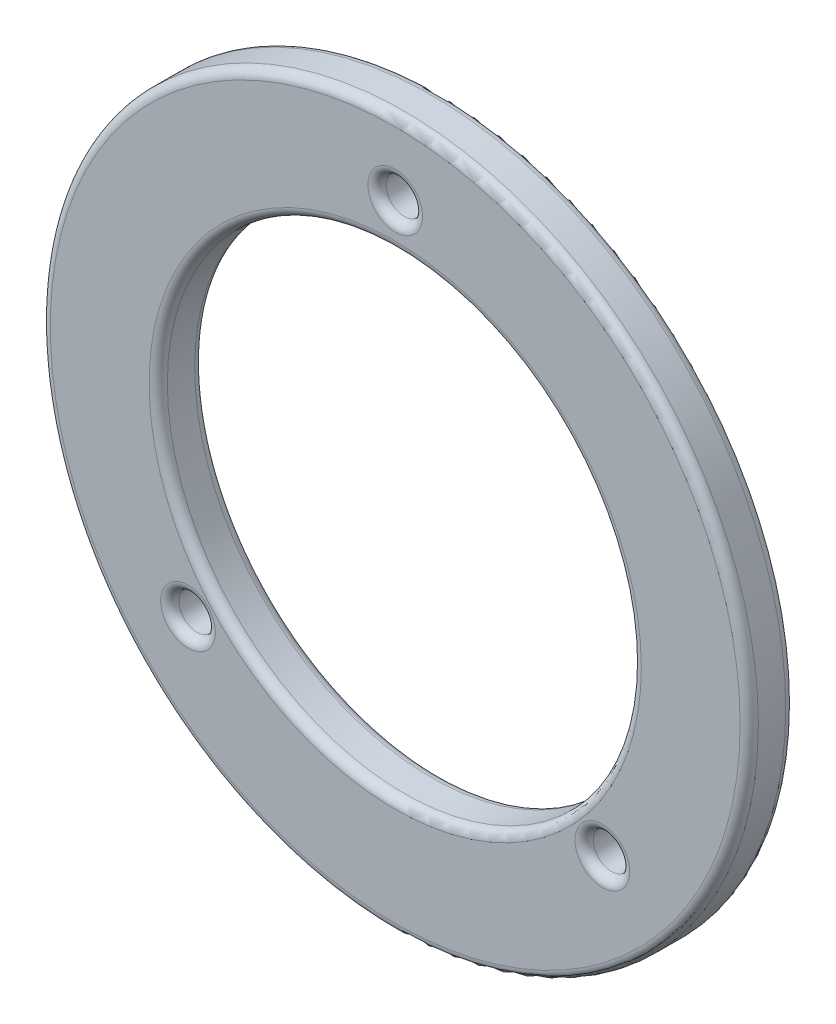
ISO-10303-21;
HEADER;
FILE_DESCRIPTION(('STEP AP214'),'2;1');
FILE_NAME('part.step','',(''),(''),'','','');
FILE_SCHEMA(('AUTOMOTIVE_DESIGN { 1 0 10303 214 1 1 1 1 }'));
ENDSEC;
DATA;
#1=APPLICATION_CONTEXT('core data for automotive mechanical design processes');
#2=APPLICATION_PROTOCOL_DEFINITION('international standard','automotive_design',2000,#1);
#3=PRODUCT_CONTEXT('',#1,'mechanical');
#4=PRODUCT('Part','Part','',(#3));
#5=PRODUCT_RELATED_PRODUCT_CATEGORY('part','',(#4));
#6=PRODUCT_DEFINITION_FORMATION('','',#4);
#7=PRODUCT_DEFINITION_CONTEXT('part definition',#1,'design');
#8=PRODUCT_DEFINITION('design','',#6,#7);
#9=PRODUCT_DEFINITION_SHAPE('','',#8);
#10=(LENGTH_UNIT() NAMED_UNIT(*) SI_UNIT(.MILLI.,.METRE.));
#11=(NAMED_UNIT(*) PLANE_ANGLE_UNIT() SI_UNIT($,.RADIAN.));
#12=(NAMED_UNIT(*) SI_UNIT($,.STERADIAN.) SOLID_ANGLE_UNIT());
#13=UNCERTAINTY_MEASURE_WITH_UNIT(LENGTH_MEASURE(1.E-05),#10,'distance_accuracy_value','');
#14=(GEOMETRIC_REPRESENTATION_CONTEXT(3) GLOBAL_UNCERTAINTY_ASSIGNED_CONTEXT((#13)) GLOBAL_UNIT_ASSIGNED_CONTEXT((#10,
#11,#12)) REPRESENTATION_CONTEXT('',''));
#15=CARTESIAN_POINT('',(0.,0.,0.));
#16=DIRECTION('',(0.,0.,1.));
#17=DIRECTION('',(1.,0.,0.));
#18=AXIS2_PLACEMENT_3D('',#15,#16,#17);
#19=CARTESIAN_POINT('',(7.49400541621981E-13,39.1668000000001,3.17500000000004));
#20=DIRECTION('',(0.,0.,-1.));
#21=DIRECTION('',(-1.00000000000001,0.,0.));
#22=AXIS2_PLACEMENT_3D('',#19,#20,#21);
#23=CYLINDRICAL_SURFACE('',#22,2.54);
#24=CARTESIAN_POINT('',(-7.49400541621981E-13,39.1668000000001,-1.90500000000005));
#25=DIRECTION('',(0.,0.,1.));
#26=DIRECTION('',(1.00000000000001,0.,0.));
#27=AXIS2_PLACEMENT_3D('',#24,#25,#26);
#28=CIRCLE('',#27,2.54);
#29=CARTESIAN_POINT('',(2.53999999999928,39.1668000000001,-1.90500000000004));
#30=VERTEX_POINT('',#29);
#31=EDGE_CURVE('E96',#30,#30,#28,.F.);
#32=ORIENTED_EDGE('',*,*,#31,.T.);
#33=EDGE_LOOP('',(#32));
#34=FACE_BOUND('',#33,.T.);
#35=CARTESIAN_POINT('',(4.9960036108132E-13,39.1668000000001,1.90500000000005));
#36=DIRECTION('',(0.,0.,1.));
#37=DIRECTION('',(1.00000000000001,0.,0.));
#38=AXIS2_PLACEMENT_3D('',#35,#36,#37);
#39=CIRCLE('',#38,2.54);
#40=CARTESIAN_POINT('',(2.54000000000053,39.1668000000001,1.90500000000005));
#41=VERTEX_POINT('',#40);
#42=EDGE_CURVE('E100',#41,#41,#39,.T.);
#43=ORIENTED_EDGE('',*,*,#42,.T.);
#44=EDGE_LOOP('',(#43));
#45=FACE_BOUND('',#44,.T.);
#46=ADVANCED_FACE('F42',(#34,#45),#23,.F.);
#47=CARTESIAN_POINT('',(7.49400541621981E-13,0.,3.17500000000004));
#48=DIRECTION('',(0.,0.,-1.));
#49=DIRECTION('',(-1.00000000000001,0.,0.));
#50=AXIS2_PLACEMENT_3D('',#47,#48,#49);
#51=CYLINDRICAL_SURFACE('',#50,33.02);
#52=CARTESIAN_POINT('',(-7.49400541621981E-13,0.,-1.90500000000005));
#53=DIRECTION('',(0.,0.,1.));
#54=DIRECTION('',(1.00000000000001,0.,0.));
#55=AXIS2_PLACEMENT_3D('',#52,#53,#54);
#56=CIRCLE('',#55,33.02);
#57=CARTESIAN_POINT('',(33.0199999999996,0.,-1.90500000000003));
#58=VERTEX_POINT('',#57);
#59=EDGE_CURVE('E88',#58,#58,#56,.F.);
#60=ORIENTED_EDGE('',*,*,#59,.T.);
#61=EDGE_LOOP('',(#60));
#62=FACE_BOUND('',#61,.T.);
#63=CARTESIAN_POINT('',(7.49400541621981E-13,0.,1.90500000000005));
#64=DIRECTION('',(0.,0.,1.));
#65=DIRECTION('',(1.00000000000001,0.,0.));
#66=AXIS2_PLACEMENT_3D('',#63,#64,#65);
#67=CIRCLE('',#66,33.02);
#68=CARTESIAN_POINT('',(33.0200000000011,0.,1.90500000000006));
#69=VERTEX_POINT('',#68);
#70=EDGE_CURVE('E92',#69,#69,#67,.T.);
#71=ORIENTED_EDGE('',*,*,#70,.T.);
#72=EDGE_LOOP('',(#71));
#73=FACE_BOUND('',#72,.T.);
#74=ADVANCED_FACE('F153',(#62,#73),#51,.F.);
#75=CARTESIAN_POINT('',(28.8671000000005,-25.4558618300422,3.17500000000104));
#76=DIRECTION('',(0.,0.,-1.));
#77=DIRECTION('',(-1.00000000000001,0.,0.));
#78=AXIS2_PLACEMENT_3D('',#75,#76,#77);
#79=CYLINDRICAL_SURFACE('',#78,2.54000000000001);
#80=CARTESIAN_POINT('',(28.8671000000001,-25.4558618300422,-1.90499999999894));
#81=DIRECTION('',(0.,0.,1.));
#82=DIRECTION('',(1.00000000000001,0.,0.));
#83=AXIS2_PLACEMENT_3D('',#80,#81,#82);
#84=CIRCLE('',#83,2.54000000000001);
#85=CARTESIAN_POINT('',(31.4071000000001,-25.4558618300422,-1.90499999999893));
#86=VERTEX_POINT('',#85);
#87=EDGE_CURVE('E80',#86,#86,#84,.F.);
#88=ORIENTED_EDGE('',*,*,#87,.T.);
#89=EDGE_LOOP('',(#88));
#90=FACE_BOUND('',#89,.T.);
#91=CARTESIAN_POINT('',(28.8671000000008,-25.4558618300422,1.90500000000104));
#92=DIRECTION('',(0.,0.,1.));
#93=DIRECTION('',(1.00000000000001,0.,0.));
#94=AXIS2_PLACEMENT_3D('',#91,#92,#93);
#95=CIRCLE('',#94,2.54000000000001);
#96=CARTESIAN_POINT('',(31.4071000000008,-25.4558618300422,1.90500000000105));
#97=VERTEX_POINT('',#96);
#98=EDGE_CURVE('E84',#97,#97,#95,.T.);
#99=ORIENTED_EDGE('',*,*,#98,.T.);
#100=EDGE_LOOP('',(#99));
#101=FACE_BOUND('',#100,.T.);
#102=ADVANCED_FACE('F159',(#90,#101),#79,.F.);
#103=CARTESIAN_POINT('',(-28.8671000000011,-25.4558618300422,3.17500000000004));
#104=DIRECTION('',(0.,0.,-1.));
#105=DIRECTION('',(-1.00000000000001,0.,0.));
#106=AXIS2_PLACEMENT_3D('',#103,#104,#105);
#107=CYLINDRICAL_SURFACE('',#106,2.54);
#108=CARTESIAN_POINT('',(-28.867100000001,-25.4558618300422,-1.90500000000005));
#109=DIRECTION('',(0.,0.,1.));
#110=DIRECTION('',(1.00000000000001,0.,0.));
#111=AXIS2_PLACEMENT_3D('',#108,#109,#110);
#112=CIRCLE('',#111,2.54);
#113=CARTESIAN_POINT('',(-26.327100000001,-25.4558618300422,-1.90500000000004));
#114=VERTEX_POINT('',#113);
#115=EDGE_CURVE('E72',#114,#114,#112,.F.);
#116=ORIENTED_EDGE('',*,*,#115,.T.);
#117=EDGE_LOOP('',(#116));
#118=FACE_BOUND('',#117,.T.);
#119=CARTESIAN_POINT('',(-28.8671000000003,-25.4558618300422,1.90499999999993));
#120=DIRECTION('',(0.,0.,1.));
#121=DIRECTION('',(1.00000000000001,0.,0.));
#122=AXIS2_PLACEMENT_3D('',#119,#120,#121);
#123=CIRCLE('',#122,2.54);
#124=CARTESIAN_POINT('',(-26.3271000000003,-25.4558618300422,1.90499999999994));
#125=VERTEX_POINT('',#124);
#126=EDGE_CURVE('E76',#125,#125,#123,.T.);
#127=ORIENTED_EDGE('',*,*,#126,.T.);
#128=EDGE_LOOP('',(#127));
#129=FACE_BOUND('',#128,.T.);
#130=ADVANCED_FACE('F168',(#118,#129),#107,.F.);
#131=CARTESIAN_POINT('',(7.49400541621981E-13,0.,3.17500000000004));
#132=DIRECTION('',(0.,0.,-1.));
#133=DIRECTION('',(-1.00000000000001,0.,0.));
#134=AXIS2_PLACEMENT_3D('',#131,#132,#133);
#135=CYLINDRICAL_SURFACE('',#134,49.3268);
#136=CARTESIAN_POINT('',(-7.49400541621981E-13,0.,-1.90500000000005));
#137=DIRECTION('',(0.,0.,1.));
#138=DIRECTION('',(1.00000000000001,0.,0.));
#139=AXIS2_PLACEMENT_3D('',#136,#137,#138);
#140=CIRCLE('',#139,49.3268);
#141=CARTESIAN_POINT('',(49.3267999999998,0.,-1.90500000000003));
#142=VERTEX_POINT('',#141);
#143=EDGE_CURVE('E124',#142,#142,#140,.T.);
#144=ORIENTED_EDGE('',*,*,#143,.T.);
#145=EDGE_LOOP('',(#144));
#146=FACE_BOUND('',#145,.T.);
#147=CARTESIAN_POINT('',(7.49400541621981E-13,0.,1.90500000000005));
#148=DIRECTION('',(0.,0.,1.));
#149=DIRECTION('',(1.00000000000001,0.,0.));
#150=AXIS2_PLACEMENT_3D('',#147,#148,#149);
#151=CIRCLE('',#150,49.3268);
#152=CARTESIAN_POINT('',(49.3268000000013,0.,1.90500000000006));
#153=VERTEX_POINT('',#152);
#154=EDGE_CURVE('E128',#153,#153,#151,.F.);
#155=ORIENTED_EDGE('',*,*,#154,.T.);
#156=EDGE_LOOP('',(#155));
#157=FACE_BOUND('',#156,.T.);
#158=ADVANCED_FACE('F134',(#146,#157),#135,.T.);
#159=CARTESIAN_POINT('',(7.49400541621981E-13,0.,3.17500000000004));
#160=DIRECTION('',(0.,0.,1.));
#161=DIRECTION('',(1.00000000000001,0.,0.));
#162=AXIS2_PLACEMENT_3D('',#159,#160,#161);
#163=PLANE('',#162);
#164=CARTESIAN_POINT('',(7.49400541621981E-13,0.,3.17500000000004));
#165=DIRECTION('',(0.,0.,1.));
#166=DIRECTION('',(1.00000000000001,0.,0.));
#167=AXIS2_PLACEMENT_3D('',#164,#165,#166);
#168=CIRCLE('',#167,48.0568);
#169=CARTESIAN_POINT('',(48.0568000000013,0.,3.17500000000005));
#170=VERTEX_POINT('',#169);
#171=EDGE_CURVE('E10',#170,#170,#168,.T.);
#172=ORIENTED_EDGE('',*,*,#171,.T.);
#173=EDGE_LOOP('',(#172));
#174=FACE_BOUND('',#173,.T.);
#175=CARTESIAN_POINT('',(7.49400541621981E-13,39.1668000000001,3.17500000000004));
#176=DIRECTION('',(0.,0.,1.));
#177=DIRECTION('',(1.00000000000001,0.,0.));
#178=AXIS2_PLACEMENT_3D('',#175,#176,#177);
#179=CIRCLE('',#178,3.81);
#180=CARTESIAN_POINT('',(3.8100000000008,39.1668000000001,3.17500000000004));
#181=VERTEX_POINT('',#180);
#182=EDGE_CURVE('E50',#181,#181,#179,.F.);
#183=ORIENTED_EDGE('',*,*,#182,.T.);
#184=EDGE_LOOP('',(#183));
#185=FACE_BOUND('',#184,.T.);
#186=CARTESIAN_POINT('',(7.49400541621981E-13,0.,3.17500000000004));
#187=DIRECTION('',(0.,0.,1.));
#188=DIRECTION('',(1.00000000000001,0.,0.));
#189=AXIS2_PLACEMENT_3D('',#186,#187,#188);
#190=CIRCLE('',#189,34.29);
#191=CARTESIAN_POINT('',(34.2900000000012,0.,3.17500000000005));
#192=VERTEX_POINT('',#191);
#193=EDGE_CURVE('E56',#192,#192,#190,.F.);
#194=ORIENTED_EDGE('',*,*,#193,.T.);
#195=EDGE_LOOP('',(#194));
#196=FACE_BOUND('',#195,.T.);
#197=CARTESIAN_POINT('',(28.8671000000005,-25.4558618300422,3.17500000000104));
#198=DIRECTION('',(0.,0.,1.));
#199=DIRECTION('',(1.00000000000001,0.,0.));
#200=AXIS2_PLACEMENT_3D('',#197,#198,#199);
#201=CIRCLE('',#200,3.81000000000001);
#202=CARTESIAN_POINT('',(32.6771000000005,-25.4558618300422,3.17500000000104));
#203=VERTEX_POINT('',#202);
#204=EDGE_CURVE('E62',#203,#203,#201,.F.);
#205=ORIENTED_EDGE('',*,*,#204,.T.);
#206=EDGE_LOOP('',(#205));
#207=FACE_BOUND('',#206,.T.);
#208=CARTESIAN_POINT('',(-28.8671000000011,-25.4558618300422,3.17500000000004));
#209=DIRECTION('',(0.,0.,1.));
#210=DIRECTION('',(1.00000000000001,0.,0.));
#211=AXIS2_PLACEMENT_3D('',#208,#209,#210);
#212=CIRCLE('',#211,3.81);
#213=CARTESIAN_POINT('',(-25.057100000001,-25.4558618300422,3.17500000000004));
#214=VERTEX_POINT('',#213);
#215=EDGE_CURVE('E68',#214,#214,#212,.F.);
#216=ORIENTED_EDGE('',*,*,#215,.T.);
#217=EDGE_LOOP('',(#216));
#218=FACE_BOUND('',#217,.T.);
#219=ADVANCED_FACE('F196',(#174,#185,#196,#207,#218),#163,.T.);
#220=CARTESIAN_POINT('',(-7.49400541621981E-13,0.,-3.17500000000004));
#221=DIRECTION('',(0.,0.,1.));
#222=DIRECTION('',(1.00000000000001,0.,0.));
#223=AXIS2_PLACEMENT_3D('',#220,#221,#222);
#224=PLANE('',#223);
#225=CARTESIAN_POINT('',(-7.49400541621981E-13,0.,-3.17500000000004));
#226=DIRECTION('',(0.,0.,1.));
#227=DIRECTION('',(1.00000000000001,0.,0.));
#228=AXIS2_PLACEMENT_3D('',#225,#226,#227);
#229=CIRCLE('',#228,48.0568);
#230=CARTESIAN_POINT('',(48.0567999999998,0.,-3.17500000000002));
#231=VERTEX_POINT('',#230);
#232=EDGE_CURVE('E104',#231,#231,#229,.F.);
#233=ORIENTED_EDGE('',*,*,#232,.T.);
#234=EDGE_LOOP('',(#233));
#235=FACE_BOUND('',#234,.T.);
#236=CARTESIAN_POINT('',(0.,39.1668000000001,-3.17500000000004));
#237=DIRECTION('',(0.,0.,1.));
#238=DIRECTION('',(1.00000000000001,0.,0.));
#239=AXIS2_PLACEMENT_3D('',#236,#237,#238);
#240=CIRCLE('',#239,3.81);
#241=CARTESIAN_POINT('',(3.81000000000005,39.1668000000001,-3.17500000000004));
#242=VERTEX_POINT('',#241);
#243=EDGE_CURVE('E108',#242,#242,#240,.T.);
#244=ORIENTED_EDGE('',*,*,#243,.T.);
#245=EDGE_LOOP('',(#244));
#246=FACE_BOUND('',#245,.T.);
#247=CARTESIAN_POINT('',(-7.49400541621981E-13,0.,-3.17500000000004));
#248=DIRECTION('',(0.,0.,1.));
#249=DIRECTION('',(1.00000000000001,0.,0.));
#250=AXIS2_PLACEMENT_3D('',#247,#248,#249);
#251=CIRCLE('',#250,34.29);
#252=CARTESIAN_POINT('',(34.2899999999997,0.,-3.17500000000003));
#253=VERTEX_POINT('',#252);
#254=EDGE_CURVE('E112',#253,#253,#251,.T.);
#255=ORIENTED_EDGE('',*,*,#254,.T.);
#256=EDGE_LOOP('',(#255));
#257=FACE_BOUND('',#256,.T.);
#258=CARTESIAN_POINT('',(28.8671000000004,-25.4558618300422,-3.17499999999904));
#259=DIRECTION('',(0.,0.,1.));
#260=DIRECTION('',(1.00000000000001,0.,0.));
#261=AXIS2_PLACEMENT_3D('',#258,#259,#260);
#262=CIRCLE('',#261,3.81000000000001);
#263=CARTESIAN_POINT('',(32.6771000000005,-25.4558618300422,-3.17499999999904));
#264=VERTEX_POINT('',#263);
#265=EDGE_CURVE('E116',#264,#264,#262,.T.);
#266=ORIENTED_EDGE('',*,*,#265,.T.);
#267=EDGE_LOOP('',(#266));
#268=FACE_BOUND('',#267,.T.);
#269=CARTESIAN_POINT('',(-28.867100000001,-25.4558618300422,-3.17500000000004));
#270=DIRECTION('',(0.,0.,1.));
#271=DIRECTION('',(1.00000000000001,0.,0.));
#272=AXIS2_PLACEMENT_3D('',#269,#270,#271);
#273=CIRCLE('',#272,3.81);
#274=CARTESIAN_POINT('',(-25.057100000001,-25.4558618300422,-3.17500000000004));
#275=VERTEX_POINT('',#274);
#276=EDGE_CURVE('E120',#275,#275,#273,.T.);
#277=ORIENTED_EDGE('',*,*,#276,.T.);
#278=EDGE_LOOP('',(#277));
#279=FACE_BOUND('',#278,.T.);
#280=ADVANCED_FACE('F177',(#235,#246,#257,#268,#279),#224,.F.);
#281=CARTESIAN_POINT('',(-7.49400541621981E-13,0.,-1.90500000000005));
#282=DIRECTION('',(0.,0.,1.));
#283=DIRECTION('',(1.00000000000001,0.,0.));
#284=AXIS2_PLACEMENT_3D('',#281,#282,#283);
#285=TOROIDAL_SURFACE('',#284,48.0568,1.27);
#286=ORIENTED_EDGE('',*,*,#232,.F.);
#287=EDGE_LOOP('',(#286));
#288=FACE_BOUND('',#287,.T.);
#289=ORIENTED_EDGE('',*,*,#143,.F.);
#290=EDGE_LOOP('',(#289));
#291=FACE_BOUND('',#290,.T.);
#292=ADVANCED_FACE('F173',(#288,#291),#285,.T.);
#293=CARTESIAN_POINT('',(-7.49400541621981E-13,39.1668000000001,-1.90500000000005));
#294=DIRECTION('',(0.,0.,1.));
#295=DIRECTION('',(1.00000000000001,0.,0.));
#296=AXIS2_PLACEMENT_3D('',#293,#294,#295);
#297=TOROIDAL_SURFACE('',#296,3.81,1.27);
#298=ORIENTED_EDGE('',*,*,#31,.F.);
#299=EDGE_LOOP('',(#298));
#300=FACE_BOUND('',#299,.T.);
#301=ORIENTED_EDGE('',*,*,#243,.F.);
#302=EDGE_LOOP('',(#301));
#303=FACE_BOUND('',#302,.T.);
#304=ADVANCED_FACE('F176',(#300,#303),#297,.T.);
#305=CARTESIAN_POINT('',(-7.49400541621981E-13,0.,-1.90500000000005));
#306=DIRECTION('',(0.,0.,1.));
#307=DIRECTION('',(1.00000000000001,0.,0.));
#308=AXIS2_PLACEMENT_3D('',#305,#306,#307);
#309=TOROIDAL_SURFACE('',#308,34.29,1.27);
#310=ORIENTED_EDGE('',*,*,#59,.F.);
#311=EDGE_LOOP('',(#310));
#312=FACE_BOUND('',#311,.T.);
#313=ORIENTED_EDGE('',*,*,#254,.F.);
#314=EDGE_LOOP('',(#313));
#315=FACE_BOUND('',#314,.T.);
#316=ADVANCED_FACE('F181',(#312,#315),#309,.T.);
#317=CARTESIAN_POINT('',(28.8671000000001,-25.4558618300422,-1.90499999999894));
#318=DIRECTION('',(0.,0.,1.));
#319=DIRECTION('',(1.00000000000001,0.,0.));
#320=AXIS2_PLACEMENT_3D('',#317,#318,#319);
#321=TOROIDAL_SURFACE('',#320,3.81000000000001,1.27);
#322=ORIENTED_EDGE('',*,*,#87,.F.);
#323=EDGE_LOOP('',(#322));
#324=FACE_BOUND('',#323,.T.);
#325=ORIENTED_EDGE('',*,*,#265,.F.);
#326=EDGE_LOOP('',(#325));
#327=FACE_BOUND('',#326,.T.);
#328=ADVANCED_FACE('F149',(#324,#327),#321,.T.);
#329=CARTESIAN_POINT('',(-28.867100000001,-25.4558618300422,-1.90500000000005));
#330=DIRECTION('',(0.,0.,1.));
#331=DIRECTION('',(1.00000000000001,0.,0.));
#332=AXIS2_PLACEMENT_3D('',#329,#330,#331);
#333=TOROIDAL_SURFACE('',#332,3.81,1.27);
#334=ORIENTED_EDGE('',*,*,#115,.F.);
#335=EDGE_LOOP('',(#334));
#336=FACE_BOUND('',#335,.T.);
#337=ORIENTED_EDGE('',*,*,#276,.F.);
#338=EDGE_LOOP('',(#337));
#339=FACE_BOUND('',#338,.T.);
#340=ADVANCED_FACE('F140',(#336,#339),#333,.T.);
#341=CARTESIAN_POINT('',(7.49400541621981E-13,0.,1.90500000000005));
#342=DIRECTION('',(0.,0.,1.));
#343=DIRECTION('',(1.00000000000001,0.,0.));
#344=AXIS2_PLACEMENT_3D('',#341,#342,#343);
#345=TOROIDAL_SURFACE('',#344,48.0568,1.27);
#346=ORIENTED_EDGE('',*,*,#154,.F.);
#347=EDGE_LOOP('',(#346));
#348=FACE_BOUND('',#347,.T.);
#349=ORIENTED_EDGE('',*,*,#171,.F.);
#350=EDGE_LOOP('',(#349));
#351=FACE_BOUND('',#350,.T.);
#352=ADVANCED_FACE('F136',(#348,#351),#345,.T.);
#353=CARTESIAN_POINT('',(4.9960036108132E-13,39.1668000000001,1.90500000000005));
#354=DIRECTION('',(0.,0.,1.));
#355=DIRECTION('',(1.00000000000001,0.,0.));
#356=AXIS2_PLACEMENT_3D('',#353,#354,#355);
#357=TOROIDAL_SURFACE('',#356,3.81,1.27);
#358=ORIENTED_EDGE('',*,*,#182,.F.);
#359=EDGE_LOOP('',(#358));
#360=FACE_BOUND('',#359,.T.);
#361=ORIENTED_EDGE('',*,*,#42,.F.);
#362=EDGE_LOOP('',(#361));
#363=FACE_BOUND('',#362,.T.);
#364=ADVANCED_FACE('F139',(#360,#363),#357,.T.);
#365=CARTESIAN_POINT('',(7.49400541621981E-13,0.,1.90500000000005));
#366=DIRECTION('',(0.,0.,1.));
#367=DIRECTION('',(1.00000000000001,0.,0.));
#368=AXIS2_PLACEMENT_3D('',#365,#366,#367);
#369=TOROIDAL_SURFACE('',#368,34.29,1.27);
#370=ORIENTED_EDGE('',*,*,#193,.F.);
#371=EDGE_LOOP('',(#370));
#372=FACE_BOUND('',#371,.T.);
#373=ORIENTED_EDGE('',*,*,#70,.F.);
#374=EDGE_LOOP('',(#373));
#375=FACE_BOUND('',#374,.T.);
#376=ADVANCED_FACE('F146',(#372,#375),#369,.T.);
#377=CARTESIAN_POINT('',(28.8671000000008,-25.4558618300422,1.90500000000104));
#378=DIRECTION('',(0.,0.,1.));
#379=DIRECTION('',(1.00000000000001,0.,0.));
#380=AXIS2_PLACEMENT_3D('',#377,#378,#379);
#381=TOROIDAL_SURFACE('',#380,3.81000000000001,1.27);
#382=ORIENTED_EDGE('',*,*,#204,.F.);
#383=EDGE_LOOP('',(#382));
#384=FACE_BOUND('',#383,.T.);
#385=ORIENTED_EDGE('',*,*,#98,.F.);
#386=EDGE_LOOP('',(#385));
#387=FACE_BOUND('',#386,.T.);
#388=ADVANCED_FACE('F274',(#384,#387),#381,.T.);
#389=CARTESIAN_POINT('',(-28.8671000000003,-25.4558618300422,1.90499999999993));
#390=DIRECTION('',(0.,0.,1.));
#391=DIRECTION('',(1.00000000000001,0.,0.));
#392=AXIS2_PLACEMENT_3D('',#389,#390,#391);
#393=TOROIDAL_SURFACE('',#392,3.81,1.27);
#394=ORIENTED_EDGE('',*,*,#215,.F.);
#395=EDGE_LOOP('',(#394));
#396=FACE_BOUND('',#395,.T.);
#397=ORIENTED_EDGE('',*,*,#126,.F.);
#398=EDGE_LOOP('',(#397));
#399=FACE_BOUND('',#398,.T.);
#400=ADVANCED_FACE('F44',(#396,#399),#393,.T.);
#401=CLOSED_SHELL('',(#46,#74,#102,#130,#158,#219,#280,#292,#304,#316,#328,#340,#352,#364,#376,
#388,#400));
#402=MANIFOLD_SOLID_BREP('B2',#401);
#403=ADVANCED_BREP_SHAPE_REPRESENTATION('',(#18,#402),#14);
#404=SHAPE_DEFINITION_REPRESENTATION(#9,#403);
ENDSEC;
END-ISO-10303-21;
